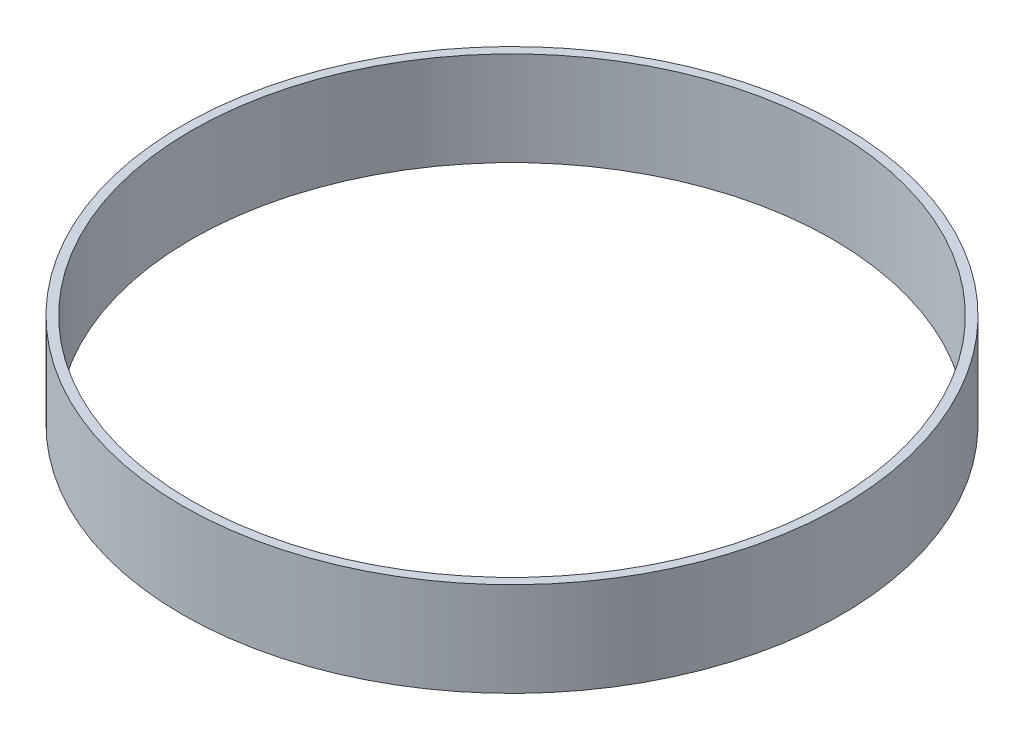
ISO-10303-21;
HEADER;
FILE_DESCRIPTION(('STEP AP214'),'2;1');
FILE_NAME('part.step','',(''),(''),'','','');
FILE_SCHEMA(('AUTOMOTIVE_DESIGN { 1 0 10303 214 1 1 1 1 }'));
ENDSEC;
DATA;
#1=APPLICATION_CONTEXT('core data for automotive mechanical design processes');
#2=APPLICATION_PROTOCOL_DEFINITION('international standard','automotive_design',2000,#1);
#3=PRODUCT_CONTEXT('',#1,'mechanical');
#4=PRODUCT('Part','Part','',(#3));
#5=PRODUCT_RELATED_PRODUCT_CATEGORY('part','',(#4));
#6=PRODUCT_DEFINITION_FORMATION('','',#4);
#7=PRODUCT_DEFINITION_CONTEXT('part definition',#1,'design');
#8=PRODUCT_DEFINITION('design','',#6,#7);
#9=PRODUCT_DEFINITION_SHAPE('','',#8);
#10=(LENGTH_UNIT() NAMED_UNIT(*) SI_UNIT(.MILLI.,.METRE.));
#11=(NAMED_UNIT(*) PLANE_ANGLE_UNIT() SI_UNIT($,.RADIAN.));
#12=(NAMED_UNIT(*) SI_UNIT($,.STERADIAN.) SOLID_ANGLE_UNIT());
#13=UNCERTAINTY_MEASURE_WITH_UNIT(LENGTH_MEASURE(1.E-05),#10,'distance_accuracy_value','');
#14=(GEOMETRIC_REPRESENTATION_CONTEXT(3) GLOBAL_UNCERTAINTY_ASSIGNED_CONTEXT((#13)) GLOBAL_UNIT_ASSIGNED_CONTEXT((#10,
#11,#12)) REPRESENTATION_CONTEXT('',''));
#15=CARTESIAN_POINT('',(0.,0.,0.));
#16=DIRECTION('',(0.,0.,1.));
#17=DIRECTION('',(1.,0.,0.));
#18=AXIS2_PLACEMENT_3D('',#15,#16,#17);
#19=CARTESIAN_POINT('',(0.,10.,0.));
#20=DIRECTION('',(0.,1.,0.));
#21=DIRECTION('',(0.,0.,1.));
#22=AXIS2_PLACEMENT_3D('',#19,#20,#21);
#23=PLANE('',#22);
#24=CARTESIAN_POINT('',(0.,10.,0.));
#25=DIRECTION('',(0.,1.,0.));
#26=DIRECTION('',(0.,0.,1.));
#27=AXIS2_PLACEMENT_3D('',#24,#25,#26);
#28=CIRCLE('',#27,35.);
#29=CARTESIAN_POINT('',(0.,10.,35.));
#30=VERTEX_POINT('',#29);
#31=EDGE_CURVE('E10',#30,#30,#28,.T.);
#32=ORIENTED_EDGE('',*,*,#31,.T.);
#33=EDGE_LOOP('',(#32));
#34=FACE_BOUND('',#33,.T.);
#35=CARTESIAN_POINT('',(0.,10.,0.));
#36=DIRECTION('',(0.,1.,0.));
#37=DIRECTION('',(0.,0.,1.));
#38=AXIS2_PLACEMENT_3D('',#35,#36,#37);
#39=CIRCLE('',#38,34.05);
#40=CARTESIAN_POINT('',(0.,10.,34.05));
#41=VERTEX_POINT('',#40);
#42=EDGE_CURVE('E50',#41,#41,#39,.T.);
#43=ORIENTED_EDGE('',*,*,#42,.F.);
#44=EDGE_LOOP('',(#43));
#45=FACE_BOUND('',#44,.T.);
#46=ADVANCED_FACE('F39',(#34,#45),#23,.T.);
#47=CARTESIAN_POINT('',(0.,0.,0.));
#48=DIRECTION('',(0.,1.,0.));
#49=DIRECTION('',(0.,0.,1.));
#50=AXIS2_PLACEMENT_3D('',#47,#48,#49);
#51=PLANE('',#50);
#52=CARTESIAN_POINT('',(0.,0.,0.));
#53=DIRECTION('',(0.,1.,0.));
#54=DIRECTION('',(0.,0.,1.));
#55=AXIS2_PLACEMENT_3D('',#52,#53,#54);
#56=CIRCLE('',#55,35.);
#57=CARTESIAN_POINT('',(0.,0.,35.));
#58=VERTEX_POINT('',#57);
#59=EDGE_CURVE('E43',#58,#58,#56,.T.);
#60=ORIENTED_EDGE('',*,*,#59,.F.);
#61=EDGE_LOOP('',(#60));
#62=FACE_BOUND('',#61,.T.);
#63=CARTESIAN_POINT('',(0.,0.,0.));
#64=DIRECTION('',(0.,1.,0.));
#65=DIRECTION('',(0.,0.,1.));
#66=AXIS2_PLACEMENT_3D('',#63,#64,#65);
#67=CIRCLE('',#66,34.05);
#68=CARTESIAN_POINT('',(0.,0.,34.05));
#69=VERTEX_POINT('',#68);
#70=EDGE_CURVE('E52',#69,#69,#67,.T.);
#71=ORIENTED_EDGE('',*,*,#70,.T.);
#72=EDGE_LOOP('',(#71));
#73=FACE_BOUND('',#72,.T.);
#74=ADVANCED_FACE('F62',(#62,#73),#51,.F.);
#75=CARTESIAN_POINT('',(0.,10.,0.));
#76=DIRECTION('',(0.,-1.,0.));
#77=DIRECTION('',(0.,0.,-1.));
#78=AXIS2_PLACEMENT_3D('',#75,#76,#77);
#79=CYLINDRICAL_SURFACE('',#78,35.);
#80=ORIENTED_EDGE('',*,*,#31,.F.);
#81=EDGE_LOOP('',(#80));
#82=FACE_BOUND('',#81,.T.);
#83=ORIENTED_EDGE('',*,*,#59,.T.);
#84=EDGE_LOOP('',(#83));
#85=FACE_BOUND('',#84,.T.);
#86=ADVANCED_FACE('F41',(#82,#85),#79,.T.);
#87=CARTESIAN_POINT('',(0.,10.,0.));
#88=DIRECTION('',(0.,-1.,0.));
#89=DIRECTION('',(0.,0.,-1.));
#90=AXIS2_PLACEMENT_3D('',#87,#88,#89);
#91=CYLINDRICAL_SURFACE('',#90,34.05);
#92=ORIENTED_EDGE('',*,*,#42,.T.);
#93=EDGE_LOOP('',(#92));
#94=FACE_BOUND('',#93,.T.);
#95=ORIENTED_EDGE('',*,*,#70,.F.);
#96=EDGE_LOOP('',(#95));
#97=FACE_BOUND('',#96,.T.);
#98=ADVANCED_FACE('F58',(#94,#97),#91,.F.);
#99=CLOSED_SHELL('',(#46,#74,#86,#98));
#100=MANIFOLD_SOLID_BREP('B2',#99);
#101=ADVANCED_BREP_SHAPE_REPRESENTATION('',(#18,#100),#14);
#102=SHAPE_DEFINITION_REPRESENTATION(#9,#101);
ENDSEC;
END-ISO-10303-21;
